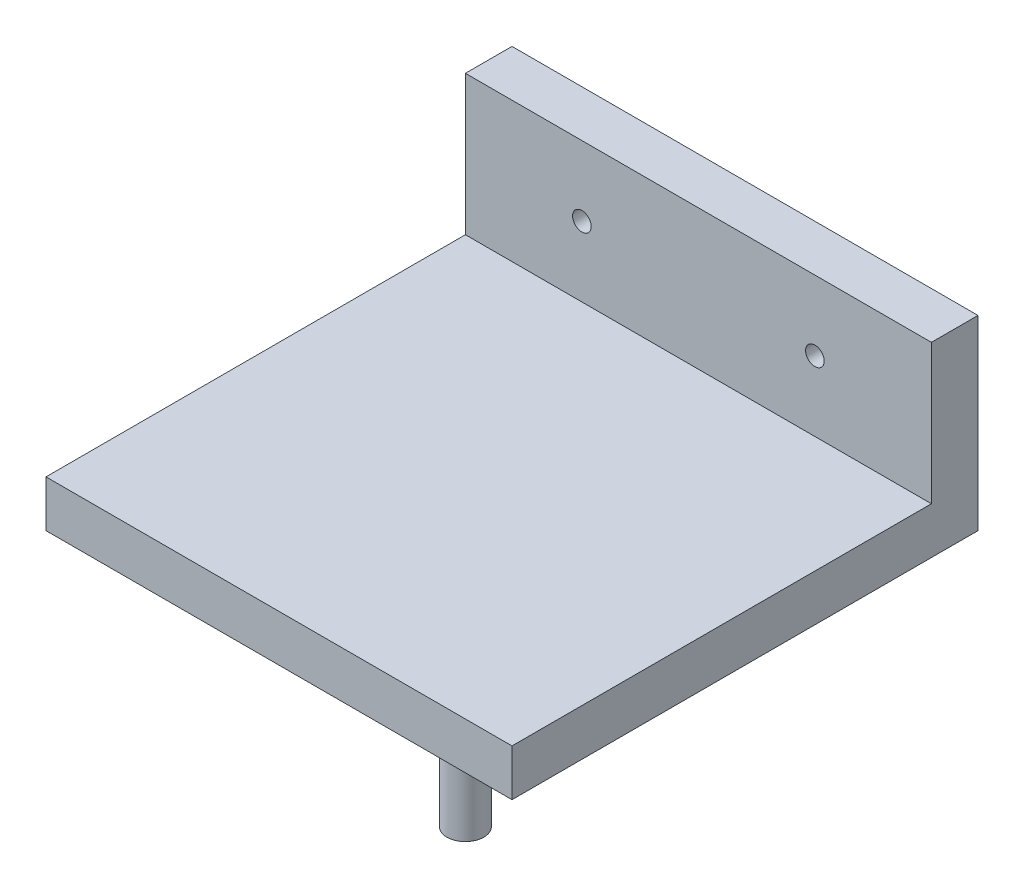
ISO-10303-21;
HEADER;
FILE_DESCRIPTION(('STEP AP214'),'2;1');
FILE_NAME('part.step','',(''),(''),'','','');
FILE_SCHEMA(('AUTOMOTIVE_DESIGN { 1 0 10303 214 1 1 1 1 }'));
ENDSEC;
DATA;
#1=APPLICATION_CONTEXT('core data for automotive mechanical design processes');
#2=APPLICATION_PROTOCOL_DEFINITION('international standard','automotive_design',2000,#1);
#3=PRODUCT_CONTEXT('',#1,'mechanical');
#4=PRODUCT('Part','Part','',(#3));
#5=PRODUCT_RELATED_PRODUCT_CATEGORY('part','',(#4));
#6=PRODUCT_DEFINITION_FORMATION('','',#4);
#7=PRODUCT_DEFINITION_CONTEXT('part definition',#1,'design');
#8=PRODUCT_DEFINITION('design','',#6,#7);
#9=PRODUCT_DEFINITION_SHAPE('','',#8);
#10=(LENGTH_UNIT() NAMED_UNIT(*) SI_UNIT(.MILLI.,.METRE.));
#11=(NAMED_UNIT(*) PLANE_ANGLE_UNIT() SI_UNIT($,.RADIAN.));
#12=(NAMED_UNIT(*) SI_UNIT($,.STERADIAN.) SOLID_ANGLE_UNIT());
#13=UNCERTAINTY_MEASURE_WITH_UNIT(LENGTH_MEASURE(1.E-05),#10,'distance_accuracy_value','');
#14=(GEOMETRIC_REPRESENTATION_CONTEXT(3) GLOBAL_UNCERTAINTY_ASSIGNED_CONTEXT((#13)) GLOBAL_UNIT_ASSIGNED_CONTEXT((#10,
#11,#12)) REPRESENTATION_CONTEXT('',''));
#15=CARTESIAN_POINT('',(0.,0.,0.));
#16=DIRECTION('',(0.,0.,1.));
#17=DIRECTION('',(1.,0.,0.));
#18=AXIS2_PLACEMENT_3D('',#15,#16,#17);
#19=CARTESIAN_POINT('',(50.,20.,10.));
#20=DIRECTION('',(-1.,0.,0.));
#21=DIRECTION('',(0.,0.,1.));
#22=AXIS2_PLACEMENT_3D('',#19,#20,#21);
#23=PLANE('',#22);
#24=DIRECTION('',(0.,1.,0.));
#25=VECTOR('',#24,1.);
#26=CARTESIAN_POINT('',(50.,20.,0.));
#27=LINE('',#26,#25);
#28=CARTESIAN_POINT('',(50.,-20.,0.));
#29=VERTEX_POINT('',#28);
#30=CARTESIAN_POINT('',(50.,20.,0.));
#31=VERTEX_POINT('',#30);
#32=EDGE_CURVE('E100',#29,#31,#27,.T.);
#33=ORIENTED_EDGE('',*,*,#32,.T.);
#34=DIRECTION('',(0.,0.,-1.));
#35=VECTOR('',#34,1.);
#36=CARTESIAN_POINT('',(50.,20.,10.));
#37=LINE('',#36,#35);
#38=CARTESIAN_POINT('',(50.,20.,10.));
#39=VERTEX_POINT('',#38);
#40=EDGE_CURVE('E47',#39,#31,#37,.T.);
#41=ORIENTED_EDGE('',*,*,#40,.F.);
#42=DIRECTION('',(0.,1.,0.));
#43=VECTOR('',#42,1.);
#44=CARTESIAN_POINT('',(50.,20.,10.));
#45=LINE('',#44,#43);
#46=CARTESIAN_POINT('',(50.,-10.,10.));
#47=VERTEX_POINT('',#46);
#48=EDGE_CURVE('E93',#47,#39,#45,.T.);
#49=ORIENTED_EDGE('',*,*,#48,.F.);
#50=DIRECTION('',(0.,0.,-1.));
#51=VECTOR('',#50,1.);
#52=CARTESIAN_POINT('',(50.,-10.,100.));
#53=LINE('',#52,#51);
#54=CARTESIAN_POINT('',(50.,-10.,100.));
#55=VERTEX_POINT('',#54);
#56=EDGE_CURVE('E109',#55,#47,#53,.T.);
#57=ORIENTED_EDGE('',*,*,#56,.F.);
#58=DIRECTION('',(0.,1.,0.));
#59=VECTOR('',#58,1.);
#60=CARTESIAN_POINT('',(50.,-20.,100.));
#61=LINE('',#60,#59);
#62=CARTESIAN_POINT('',(50.,-20.,100.));
#63=VERTEX_POINT('',#62);
#64=EDGE_CURVE('E103',#63,#55,#61,.T.);
#65=ORIENTED_EDGE('',*,*,#64,.F.);
#66=DIRECTION('',(0.,0.,-1.));
#67=VECTOR('',#66,1.);
#68=CARTESIAN_POINT('',(50.,-20.,10.));
#69=LINE('',#68,#67);
#70=EDGE_CURVE('E86',#63,#29,#69,.T.);
#71=ORIENTED_EDGE('',*,*,#70,.T.);
#72=EDGE_LOOP('',(#33,#41,#49,#57,#65,#71));
#73=FACE_BOUND('',#72,.T.);
#74=ADVANCED_FACE('F39',(#73),#23,.F.);
#75=CARTESIAN_POINT('',(-50.,20.,10.));
#76=DIRECTION('',(0.,-1.,0.));
#77=DIRECTION('',(0.,0.,-1.));
#78=AXIS2_PLACEMENT_3D('',#75,#76,#77);
#79=PLANE('',#78);
#80=DIRECTION('',(-1.,0.,0.));
#81=VECTOR('',#80,1.);
#82=CARTESIAN_POINT('',(-50.,20.,0.));
#83=LINE('',#82,#81);
#84=CARTESIAN_POINT('',(-50.,20.,0.));
#85=VERTEX_POINT('',#84);
#86=EDGE_CURVE('E107',#31,#85,#83,.T.);
#87=ORIENTED_EDGE('',*,*,#86,.T.);
#88=DIRECTION('',(0.,0.,-1.));
#89=VECTOR('',#88,1.);
#90=CARTESIAN_POINT('',(-50.,20.,10.));
#91=LINE('',#90,#89);
#92=CARTESIAN_POINT('',(-50.,20.,10.));
#93=VERTEX_POINT('',#92);
#94=EDGE_CURVE('E120',#93,#85,#91,.T.);
#95=ORIENTED_EDGE('',*,*,#94,.F.);
#96=DIRECTION('',(-1.,0.,0.));
#97=VECTOR('',#96,1.);
#98=CARTESIAN_POINT('',(-50.,20.,10.));
#99=LINE('',#98,#97);
#100=EDGE_CURVE('E61',#39,#93,#99,.T.);
#101=ORIENTED_EDGE('',*,*,#100,.F.);
#102=ORIENTED_EDGE('',*,*,#40,.T.);
#103=EDGE_LOOP('',(#87,#95,#101,#102));
#104=FACE_BOUND('',#103,.T.);
#105=ADVANCED_FACE('F171',(#104),#79,.F.);
#106=CARTESIAN_POINT('',(-50.,20.,10.));
#107=DIRECTION('',(1.,0.,0.));
#108=DIRECTION('',(0.,0.,-1.));
#109=AXIS2_PLACEMENT_3D('',#106,#107,#108);
#110=PLANE('',#109);
#111=DIRECTION('',(0.,-1.,0.));
#112=VECTOR('',#111,1.);
#113=CARTESIAN_POINT('',(-50.,20.,0.));
#114=LINE('',#113,#112);
#115=CARTESIAN_POINT('',(-50.,-20.,0.));
#116=VERTEX_POINT('',#115);
#117=EDGE_CURVE('E94',#85,#116,#114,.T.);
#118=ORIENTED_EDGE('',*,*,#117,.T.);
#119=DIRECTION('',(0.,0.,-1.));
#120=VECTOR('',#119,1.);
#121=CARTESIAN_POINT('',(-50.,-20.,10.));
#122=LINE('',#121,#120);
#123=CARTESIAN_POINT('',(-50.,-20.,100.));
#124=VERTEX_POINT('',#123);
#125=EDGE_CURVE('E89',#124,#116,#122,.T.);
#126=ORIENTED_EDGE('',*,*,#125,.F.);
#127=DIRECTION('',(0.,-1.,0.));
#128=VECTOR('',#127,1.);
#129=CARTESIAN_POINT('',(-50.,-20.,100.));
#130=LINE('',#129,#128);
#131=CARTESIAN_POINT('',(-50.,-10.,100.));
#132=VERTEX_POINT('',#131);
#133=EDGE_CURVE('E140',#132,#124,#130,.T.);
#134=ORIENTED_EDGE('',*,*,#133,.F.);
#135=DIRECTION('',(0.,0.,-1.));
#136=VECTOR('',#135,1.);
#137=CARTESIAN_POINT('',(-50.,-10.,100.));
#138=LINE('',#137,#136);
#139=CARTESIAN_POINT('',(-50.,-10.,10.));
#140=VERTEX_POINT('',#139);
#141=EDGE_CURVE('E113',#132,#140,#138,.T.);
#142=ORIENTED_EDGE('',*,*,#141,.T.);
#143=DIRECTION('',(0.,-1.,0.));
#144=VECTOR('',#143,1.);
#145=CARTESIAN_POINT('',(-50.,20.,10.));
#146=LINE('',#145,#144);
#147=EDGE_CURVE('E104',#93,#140,#146,.T.);
#148=ORIENTED_EDGE('',*,*,#147,.F.);
#149=ORIENTED_EDGE('',*,*,#94,.T.);
#150=EDGE_LOOP('',(#118,#126,#134,#142,#148,#149));
#151=FACE_BOUND('',#150,.T.);
#152=ADVANCED_FACE('F162',(#151),#110,.F.);
#153=CARTESIAN_POINT('',(-50.,-20.,10.));
#154=DIRECTION('',(0.,1.,0.));
#155=DIRECTION('',(0.,0.,1.));
#156=AXIS2_PLACEMENT_3D('',#153,#154,#155);
#157=PLANE('',#156);
#158=CARTESIAN_POINT('',(0.,-20.,60.));
#159=DIRECTION('',(0.,1.,0.));
#160=DIRECTION('',(0.,0.,1.));
#161=AXIS2_PLACEMENT_3D('',#158,#159,#160);
#162=CIRCLE('',#161,3.95);
#163=CARTESIAN_POINT('',(0.,-20.,63.95));
#164=VERTEX_POINT('',#163);
#165=EDGE_CURVE('E11',#164,#164,#162,.F.);
#166=ORIENTED_EDGE('',*,*,#165,.F.);
#167=EDGE_LOOP('',(#166));
#168=FACE_BOUND('',#167,.T.);
#169=DIRECTION('',(1.,0.,0.));
#170=VECTOR('',#169,1.);
#171=CARTESIAN_POINT('',(-50.,-20.,0.));
#172=LINE('',#171,#170);
#173=EDGE_CURVE('E81',#116,#29,#172,.T.);
#174=ORIENTED_EDGE('',*,*,#173,.T.);
#175=ORIENTED_EDGE('',*,*,#70,.F.);
#176=DIRECTION('',(1.,0.,0.));
#177=VECTOR('',#176,1.);
#178=CARTESIAN_POINT('',(-50.,-20.,100.));
#179=LINE('',#178,#177);
#180=EDGE_CURVE('E143',#124,#63,#179,.T.);
#181=ORIENTED_EDGE('',*,*,#180,.F.);
#182=ORIENTED_EDGE('',*,*,#125,.T.);
#183=EDGE_LOOP('',(#174,#175,#181,#182));
#184=FACE_BOUND('',#183,.T.);
#185=ADVANCED_FACE('F83',(#168,#184),#157,.F.);
#186=CARTESIAN_POINT('',(0.,0.,10.));
#187=DIRECTION('',(0.,0.,1.));
#188=DIRECTION('',(1.,0.,0.));
#189=AXIS2_PLACEMENT_3D('',#186,#187,#188);
#190=PLANE('',#189);
#191=CARTESIAN_POINT('',(-25.,5.,10.));
#192=DIRECTION('',(0.,0.,1.));
#193=DIRECTION('',(1.,0.,0.));
#194=AXIS2_PLACEMENT_3D('',#191,#192,#193);
#195=CIRCLE('',#194,2.);
#196=CARTESIAN_POINT('',(-23.,5.,10.));
#197=VERTEX_POINT('',#196);
#198=EDGE_CURVE('E125',#197,#197,#195,.T.);
#199=ORIENTED_EDGE('',*,*,#198,.F.);
#200=EDGE_LOOP('',(#199));
#201=FACE_BOUND('',#200,.T.);
#202=CARTESIAN_POINT('',(25.,5.,10.));
#203=DIRECTION('',(0.,0.,1.));
#204=DIRECTION('',(-1.,0.,0.));
#205=AXIS2_PLACEMENT_3D('',#202,#203,#204);
#206=CIRCLE('',#205,2.);
#207=CARTESIAN_POINT('',(23.,5.,10.));
#208=VERTEX_POINT('',#207);
#209=EDGE_CURVE('E131',#208,#208,#206,.T.);
#210=ORIENTED_EDGE('',*,*,#209,.F.);
#211=EDGE_LOOP('',(#210));
#212=FACE_BOUND('',#211,.T.);
#213=DIRECTION('',(-1.,0.,0.));
#214=VECTOR('',#213,1.);
#215=CARTESIAN_POINT('',(-50.,-10.,10.));
#216=LINE('',#215,#214);
#217=EDGE_CURVE('E55',#47,#140,#216,.T.);
#218=ORIENTED_EDGE('',*,*,#217,.F.);
#219=ORIENTED_EDGE('',*,*,#48,.T.);
#220=ORIENTED_EDGE('',*,*,#100,.T.);
#221=ORIENTED_EDGE('',*,*,#147,.T.);
#222=EDGE_LOOP('',(#218,#219,#220,#221));
#223=FACE_BOUND('',#222,.T.);
#224=ADVANCED_FACE('F154',(#201,#212,#223),#190,.T.);
#225=CARTESIAN_POINT('',(0.,0.,0.));
#226=DIRECTION('',(0.,0.,1.));
#227=DIRECTION('',(1.,0.,0.));
#228=AXIS2_PLACEMENT_3D('',#225,#226,#227);
#229=PLANE('',#228);
#230=CARTESIAN_POINT('',(-25.,5.,0.));
#231=DIRECTION('',(0.,0.,1.));
#232=DIRECTION('',(1.,0.,0.));
#233=AXIS2_PLACEMENT_3D('',#230,#231,#232);
#234=CIRCLE('',#233,2.);
#235=CARTESIAN_POINT('',(-23.,5.,0.));
#236=VERTEX_POINT('',#235);
#237=EDGE_CURVE('E42',#236,#236,#234,.T.);
#238=ORIENTED_EDGE('',*,*,#237,.T.);
#239=EDGE_LOOP('',(#238));
#240=FACE_BOUND('',#239,.T.);
#241=CARTESIAN_POINT('',(25.,5.,0.));
#242=DIRECTION('',(0.,0.,1.));
#243=DIRECTION('',(1.,0.,0.));
#244=AXIS2_PLACEMENT_3D('',#241,#242,#243);
#245=CIRCLE('',#244,2.);
#246=CARTESIAN_POINT('',(27.,5.,0.));
#247=VERTEX_POINT('',#246);
#248=EDGE_CURVE('E123',#247,#247,#245,.T.);
#249=ORIENTED_EDGE('',*,*,#248,.T.);
#250=EDGE_LOOP('',(#249));
#251=FACE_BOUND('',#250,.T.);
#252=ORIENTED_EDGE('',*,*,#32,.F.);
#253=ORIENTED_EDGE('',*,*,#173,.F.);
#254=ORIENTED_EDGE('',*,*,#117,.F.);
#255=ORIENTED_EDGE('',*,*,#86,.F.);
#256=EDGE_LOOP('',(#252,#253,#254,#255));
#257=FACE_BOUND('',#256,.T.);
#258=ADVANCED_FACE('F106',(#240,#251,#257),#229,.F.);
#259=CARTESIAN_POINT('',(-50.,-10.,100.));
#260=DIRECTION('',(0.,-1.,0.));
#261=DIRECTION('',(0.,0.,-1.));
#262=AXIS2_PLACEMENT_3D('',#259,#260,#261);
#263=PLANE('',#262);
#264=ORIENTED_EDGE('',*,*,#217,.T.);
#265=ORIENTED_EDGE('',*,*,#141,.F.);
#266=DIRECTION('',(-1.,0.,0.));
#267=VECTOR('',#266,1.);
#268=CARTESIAN_POINT('',(-50.,-10.,100.));
#269=LINE('',#268,#267);
#270=EDGE_CURVE('E146',#55,#132,#269,.T.);
#271=ORIENTED_EDGE('',*,*,#270,.F.);
#272=ORIENTED_EDGE('',*,*,#56,.T.);
#273=EDGE_LOOP('',(#264,#265,#271,#272));
#274=FACE_BOUND('',#273,.T.);
#275=ADVANCED_FACE('F159',(#274),#263,.F.);
#276=CARTESIAN_POINT('',(0.,0.,100.));
#277=DIRECTION('',(0.,0.,-1.));
#278=DIRECTION('',(-1.,0.,0.));
#279=AXIS2_PLACEMENT_3D('',#276,#277,#278);
#280=PLANE('',#279);
#281=ORIENTED_EDGE('',*,*,#133,.T.);
#282=ORIENTED_EDGE('',*,*,#180,.T.);
#283=ORIENTED_EDGE('',*,*,#64,.T.);
#284=ORIENTED_EDGE('',*,*,#270,.T.);
#285=EDGE_LOOP('',(#281,#282,#283,#284));
#286=FACE_BOUND('',#285,.T.);
#287=ADVANCED_FACE('F166',(#286),#280,.F.);
#288=CARTESIAN_POINT('',(0.,-70.,60.));
#289=DIRECTION('',(0.,1.,0.));
#290=DIRECTION('',(0.,0.,1.));
#291=AXIS2_PLACEMENT_3D('',#288,#289,#290);
#292=CYLINDRICAL_SURFACE('',#291,3.95);
#293=CARTESIAN_POINT('',(0.,-70.,60.));
#294=DIRECTION('',(0.,-1.,0.));
#295=DIRECTION('',(0.,0.,-1.));
#296=AXIS2_PLACEMENT_3D('',#293,#294,#295);
#297=CIRCLE('',#296,3.95);
#298=CARTESIAN_POINT('',(0.,-70.,56.05));
#299=VERTEX_POINT('',#298);
#300=EDGE_CURVE('E129',#299,#299,#297,.T.);
#301=ORIENTED_EDGE('',*,*,#300,.F.);
#302=EDGE_LOOP('',(#301));
#303=FACE_BOUND('',#302,.T.);
#304=ORIENTED_EDGE('',*,*,#165,.T.);
#305=EDGE_LOOP('',(#304));
#306=FACE_BOUND('',#305,.T.);
#307=ADVANCED_FACE('F192',(#303,#306),#292,.T.);
#308=CARTESIAN_POINT('',(0.,-70.,60.));
#309=DIRECTION('',(0.,-1.,0.));
#310=DIRECTION('',(0.,0.,-1.));
#311=AXIS2_PLACEMENT_3D('',#308,#309,#310);
#312=PLANE('',#311);
#313=ORIENTED_EDGE('',*,*,#300,.T.);
#314=EDGE_LOOP('',(#313));
#315=FACE_BOUND('',#314,.T.);
#316=ADVANCED_FACE('F195',(#315),#312,.T.);
#317=CARTESIAN_POINT('',(25.,5.,-40.));
#318=DIRECTION('',(0.,0.,1.));
#319=DIRECTION('',(1.,0.,0.));
#320=AXIS2_PLACEMENT_3D('',#317,#318,#319);
#321=CYLINDRICAL_SURFACE('',#320,2.);
#322=ORIENTED_EDGE('',*,*,#209,.T.);
#323=EDGE_LOOP('',(#322));
#324=FACE_BOUND('',#323,.T.);
#325=ORIENTED_EDGE('',*,*,#248,.F.);
#326=EDGE_LOOP('',(#325));
#327=FACE_BOUND('',#326,.T.);
#328=ADVANCED_FACE('F199',(#324,#327),#321,.F.);
#329=CARTESIAN_POINT('',(-25.,5.,-40.));
#330=DIRECTION('',(0.,0.,1.));
#331=DIRECTION('',(1.,0.,0.));
#332=AXIS2_PLACEMENT_3D('',#329,#330,#331);
#333=CYLINDRICAL_SURFACE('',#332,2.);
#334=ORIENTED_EDGE('',*,*,#198,.T.);
#335=EDGE_LOOP('',(#334));
#336=FACE_BOUND('',#335,.T.);
#337=ORIENTED_EDGE('',*,*,#237,.F.);
#338=EDGE_LOOP('',(#337));
#339=FACE_BOUND('',#338,.T.);
#340=ADVANCED_FACE('F203',(#336,#339),#333,.F.);
#341=CLOSED_SHELL('',(#74,#105,#152,#185,#224,#258,#275,#287,#307,#316,#328,#340));
#342=MANIFOLD_SOLID_BREP('B2',#341);
#343=ADVANCED_BREP_SHAPE_REPRESENTATION('',(#18,#342),#14);
#344=SHAPE_DEFINITION_REPRESENTATION(#9,#343);
ENDSEC;
END-ISO-10303-21;
